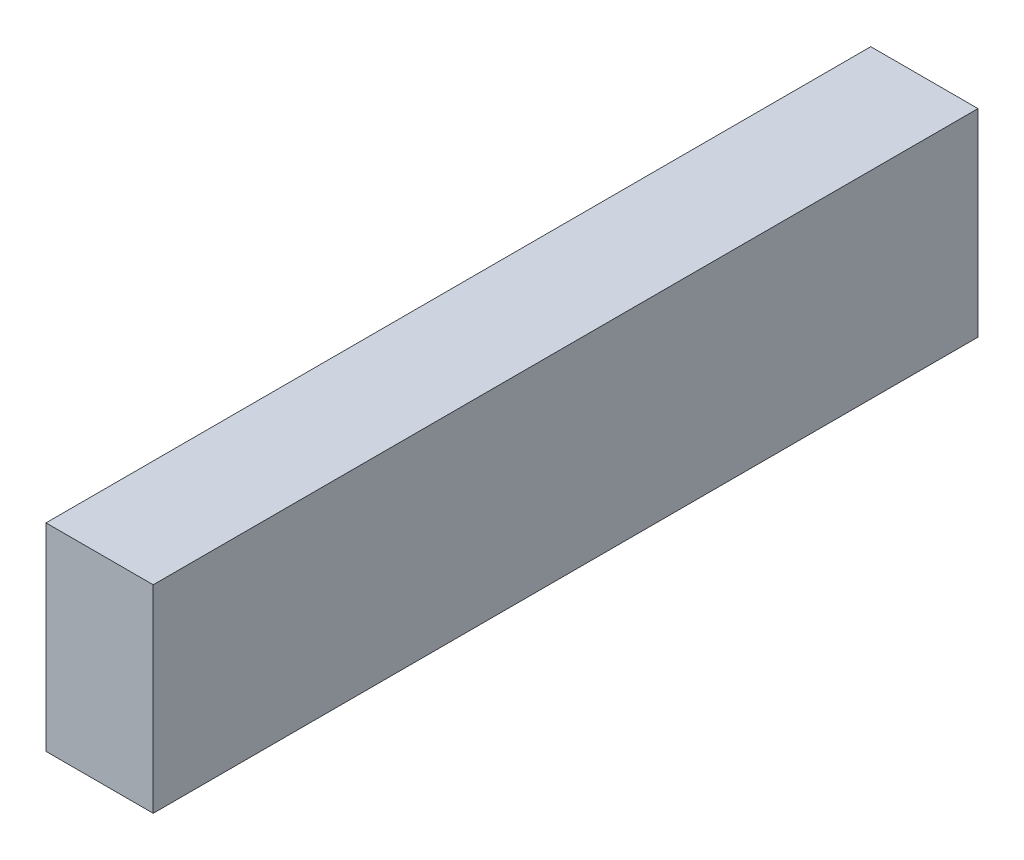
ISO-10303-21;
HEADER;
FILE_DESCRIPTION(('STEP AP214'),'2;1');
FILE_NAME('part.step','',(''),(''),'','','');
FILE_SCHEMA(('AUTOMOTIVE_DESIGN { 1 0 10303 214 1 1 1 1 }'));
ENDSEC;
DATA;
#1=APPLICATION_CONTEXT('core data for automotive mechanical design processes');
#2=APPLICATION_PROTOCOL_DEFINITION('international standard','automotive_design',2000,#1);
#3=PRODUCT_CONTEXT('',#1,'mechanical');
#4=PRODUCT('Part','Part','',(#3));
#5=PRODUCT_RELATED_PRODUCT_CATEGORY('part','',(#4));
#6=PRODUCT_DEFINITION_FORMATION('','',#4);
#7=PRODUCT_DEFINITION_CONTEXT('part definition',#1,'design');
#8=PRODUCT_DEFINITION('design','',#6,#7);
#9=PRODUCT_DEFINITION_SHAPE('','',#8);
#10=(LENGTH_UNIT() NAMED_UNIT(*) SI_UNIT(.MILLI.,.METRE.));
#11=(NAMED_UNIT(*) PLANE_ANGLE_UNIT() SI_UNIT($,.RADIAN.));
#12=(NAMED_UNIT(*) SI_UNIT($,.STERADIAN.) SOLID_ANGLE_UNIT());
#13=UNCERTAINTY_MEASURE_WITH_UNIT(LENGTH_MEASURE(1.E-05),#10,'distance_accuracy_value','');
#14=(GEOMETRIC_REPRESENTATION_CONTEXT(3) GLOBAL_UNCERTAINTY_ASSIGNED_CONTEXT((#13)) GLOBAL_UNIT_ASSIGNED_CONTEXT((#10,
#11,#12)) REPRESENTATION_CONTEXT('',''));
#15=CARTESIAN_POINT('',(0.,0.,0.));
#16=DIRECTION('',(0.,0.,1.));
#17=DIRECTION('',(1.,0.,0.));
#18=AXIS2_PLACEMENT_3D('',#15,#16,#17);
#19=CARTESIAN_POINT('',(-6.5,12.,100.));
#20=DIRECTION('',(1.,0.,0.));
#21=DIRECTION('',(0.,0.,-1.));
#22=AXIS2_PLACEMENT_3D('',#19,#20,#21);
#23=PLANE('',#22);
#24=DIRECTION('',(0.,-1.,0.));
#25=VECTOR('',#24,1.);
#26=CARTESIAN_POINT('',(-6.5,12.,0.));
#27=LINE('',#26,#25);
#28=CARTESIAN_POINT('',(-6.5,12.,0.));
#29=VERTEX_POINT('',#28);
#30=CARTESIAN_POINT('',(-6.5,-12.,0.));
#31=VERTEX_POINT('',#30);
#32=EDGE_CURVE('E96',#29,#31,#27,.T.);
#33=ORIENTED_EDGE('',*,*,#32,.T.);
#34=DIRECTION('',(0.,0.,-1.));
#35=VECTOR('',#34,1.);
#36=CARTESIAN_POINT('',(-6.5,-12.,100.));
#37=LINE('',#36,#35);
#38=CARTESIAN_POINT('',(-6.5,-12.,100.));
#39=VERTEX_POINT('',#38);
#40=EDGE_CURVE('E11',#39,#31,#37,.T.);
#41=ORIENTED_EDGE('',*,*,#40,.F.);
#42=DIRECTION('',(0.,-1.,0.));
#43=VECTOR('',#42,1.);
#44=CARTESIAN_POINT('',(-6.5,12.,100.));
#45=LINE('',#44,#43);
#46=CARTESIAN_POINT('',(-6.5,12.,100.));
#47=VERTEX_POINT('',#46);
#48=EDGE_CURVE('E84',#47,#39,#45,.T.);
#49=ORIENTED_EDGE('',*,*,#48,.F.);
#50=DIRECTION('',(0.,0.,-1.));
#51=VECTOR('',#50,1.);
#52=CARTESIAN_POINT('',(-6.5,12.,100.));
#53=LINE('',#52,#51);
#54=EDGE_CURVE('E92',#47,#29,#53,.T.);
#55=ORIENTED_EDGE('',*,*,#54,.T.);
#56=EDGE_LOOP('',(#33,#41,#49,#55));
#57=FACE_BOUND('',#56,.T.);
#58=ADVANCED_FACE('F33',(#57),#23,.F.);
#59=CARTESIAN_POINT('',(-6.5,-12.,100.));
#60=DIRECTION('',(0.,1.,0.));
#61=DIRECTION('',(0.,0.,1.));
#62=AXIS2_PLACEMENT_3D('',#59,#60,#61);
#63=PLANE('',#62);
#64=DIRECTION('',(1.,0.,0.));
#65=VECTOR('',#64,1.);
#66=CARTESIAN_POINT('',(-6.5,-12.,0.));
#67=LINE('',#66,#65);
#68=CARTESIAN_POINT('',(6.5,-12.,0.));
#69=VERTEX_POINT('',#68);
#70=EDGE_CURVE('E88',#31,#69,#67,.T.);
#71=ORIENTED_EDGE('',*,*,#70,.T.);
#72=DIRECTION('',(0.,0.,-1.));
#73=VECTOR('',#72,1.);
#74=CARTESIAN_POINT('',(6.5,-12.,100.));
#75=LINE('',#74,#73);
#76=CARTESIAN_POINT('',(6.5,-12.,100.));
#77=VERTEX_POINT('',#76);
#78=EDGE_CURVE('E41',#77,#69,#75,.T.);
#79=ORIENTED_EDGE('',*,*,#78,.F.);
#80=DIRECTION('',(1.,0.,0.));
#81=VECTOR('',#80,1.);
#82=CARTESIAN_POINT('',(-6.5,-12.,100.));
#83=LINE('',#82,#81);
#84=EDGE_CURVE('E79',#39,#77,#83,.T.);
#85=ORIENTED_EDGE('',*,*,#84,.F.);
#86=ORIENTED_EDGE('',*,*,#40,.T.);
#87=EDGE_LOOP('',(#71,#79,#85,#86));
#88=FACE_BOUND('',#87,.T.);
#89=ADVANCED_FACE('F87',(#88),#63,.F.);
#90=CARTESIAN_POINT('',(6.5,-12.,100.));
#91=DIRECTION('',(-1.,0.,0.));
#92=DIRECTION('',(0.,0.,1.));
#93=AXIS2_PLACEMENT_3D('',#90,#91,#92);
#94=PLANE('',#93);
#95=DIRECTION('',(0.,1.,0.));
#96=VECTOR('',#95,1.);
#97=CARTESIAN_POINT('',(6.5,-12.,0.));
#98=LINE('',#97,#96);
#99=CARTESIAN_POINT('',(6.5,12.,0.));
#100=VERTEX_POINT('',#99);
#101=EDGE_CURVE('E66',#69,#100,#98,.T.);
#102=ORIENTED_EDGE('',*,*,#101,.T.);
#103=DIRECTION('',(0.,0.,-1.));
#104=VECTOR('',#103,1.);
#105=CARTESIAN_POINT('',(6.5,12.,100.));
#106=LINE('',#105,#104);
#107=CARTESIAN_POINT('',(6.5,12.,100.));
#108=VERTEX_POINT('',#107);
#109=EDGE_CURVE('E89',#108,#100,#106,.T.);
#110=ORIENTED_EDGE('',*,*,#109,.F.);
#111=DIRECTION('',(0.,1.,0.));
#112=VECTOR('',#111,1.);
#113=CARTESIAN_POINT('',(6.5,-12.,100.));
#114=LINE('',#113,#112);
#115=EDGE_CURVE('E82',#77,#108,#114,.T.);
#116=ORIENTED_EDGE('',*,*,#115,.F.);
#117=ORIENTED_EDGE('',*,*,#78,.T.);
#118=EDGE_LOOP('',(#102,#110,#116,#117));
#119=FACE_BOUND('',#118,.T.);
#120=ADVANCED_FACE('F90',(#119),#94,.F.);
#121=CARTESIAN_POINT('',(6.5,12.,100.));
#122=DIRECTION('',(0.,-1.,0.));
#123=DIRECTION('',(0.,0.,-1.));
#124=AXIS2_PLACEMENT_3D('',#121,#122,#123);
#125=PLANE('',#124);
#126=DIRECTION('',(-1.,0.,0.));
#127=VECTOR('',#126,1.);
#128=CARTESIAN_POINT('',(6.5,12.,0.));
#129=LINE('',#128,#127);
#130=EDGE_CURVE('E72',#100,#29,#129,.T.);
#131=ORIENTED_EDGE('',*,*,#130,.T.);
#132=ORIENTED_EDGE('',*,*,#54,.F.);
#133=DIRECTION('',(-1.,0.,0.));
#134=VECTOR('',#133,1.);
#135=CARTESIAN_POINT('',(6.5,12.,100.));
#136=LINE('',#135,#134);
#137=EDGE_CURVE('E49',#108,#47,#136,.T.);
#138=ORIENTED_EDGE('',*,*,#137,.F.);
#139=ORIENTED_EDGE('',*,*,#109,.T.);
#140=EDGE_LOOP('',(#131,#132,#138,#139));
#141=FACE_BOUND('',#140,.T.);
#142=ADVANCED_FACE('F103',(#141),#125,.F.);
#143=CARTESIAN_POINT('',(0.,0.,100.));
#144=DIRECTION('',(0.,0.,1.));
#145=DIRECTION('',(1.,0.,0.));
#146=AXIS2_PLACEMENT_3D('',#143,#144,#145);
#147=PLANE('',#146);
#148=ORIENTED_EDGE('',*,*,#48,.T.);
#149=ORIENTED_EDGE('',*,*,#84,.T.);
#150=ORIENTED_EDGE('',*,*,#115,.T.);
#151=ORIENTED_EDGE('',*,*,#137,.T.);
#152=EDGE_LOOP('',(#148,#149,#150,#151));
#153=FACE_BOUND('',#152,.T.);
#154=ADVANCED_FACE('F80',(#153),#147,.T.);
#155=CARTESIAN_POINT('',(0.,0.,0.));
#156=DIRECTION('',(0.,0.,1.));
#157=DIRECTION('',(1.,0.,0.));
#158=AXIS2_PLACEMENT_3D('',#155,#156,#157);
#159=PLANE('',#158);
#160=ORIENTED_EDGE('',*,*,#32,.F.);
#161=ORIENTED_EDGE('',*,*,#130,.F.);
#162=ORIENTED_EDGE('',*,*,#101,.F.);
#163=ORIENTED_EDGE('',*,*,#70,.F.);
#164=EDGE_LOOP('',(#160,#161,#162,#163));
#165=FACE_BOUND('',#164,.T.);
#166=ADVANCED_FACE('F106',(#165),#159,.F.);
#167=CLOSED_SHELL('',(#58,#89,#120,#142,#154,#166));
#168=MANIFOLD_SOLID_BREP('B2',#167);
#169=ADVANCED_BREP_SHAPE_REPRESENTATION('',(#18,#168),#14);
#170=SHAPE_DEFINITION_REPRESENTATION(#9,#169);
ENDSEC;
END-ISO-10303-21;
